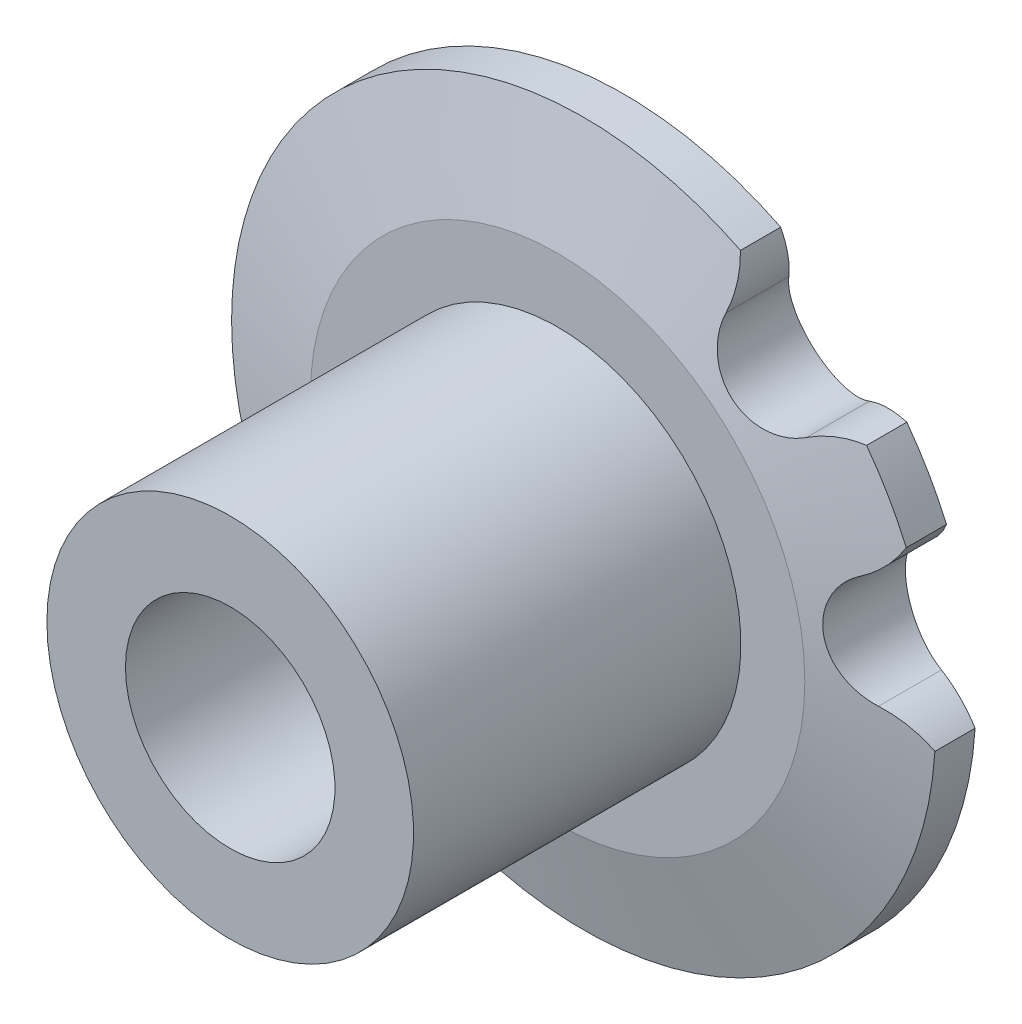
ISO-10303-21;
HEADER;
FILE_DESCRIPTION(('STEP AP214'),'2;1');
FILE_NAME('part.step','',(''),(''),'','','');
FILE_SCHEMA(('AUTOMOTIVE_DESIGN { 1 0 10303 214 1 1 1 1 }'));
ENDSEC;
DATA;
#1=APPLICATION_CONTEXT('core data for automotive mechanical design processes');
#2=APPLICATION_PROTOCOL_DEFINITION('international standard','automotive_design',2000,#1);
#3=PRODUCT_CONTEXT('',#1,'mechanical');
#4=PRODUCT('Part','Part','',(#3));
#5=PRODUCT_RELATED_PRODUCT_CATEGORY('part','',(#4));
#6=PRODUCT_DEFINITION_FORMATION('','',#4);
#7=PRODUCT_DEFINITION_CONTEXT('part definition',#1,'design');
#8=PRODUCT_DEFINITION('design','',#6,#7);
#9=PRODUCT_DEFINITION_SHAPE('','',#8);
#10=(LENGTH_UNIT() NAMED_UNIT(*) SI_UNIT(.MILLI.,.METRE.));
#11=(NAMED_UNIT(*) PLANE_ANGLE_UNIT() SI_UNIT($,.RADIAN.));
#12=(NAMED_UNIT(*) SI_UNIT($,.STERADIAN.) SOLID_ANGLE_UNIT());
#13=UNCERTAINTY_MEASURE_WITH_UNIT(LENGTH_MEASURE(1.E-05),#10,'distance_accuracy_value','');
#14=(GEOMETRIC_REPRESENTATION_CONTEXT(3) GLOBAL_UNCERTAINTY_ASSIGNED_CONTEXT((#13)) GLOBAL_UNIT_ASSIGNED_CONTEXT((#10,
#11,#12)) REPRESENTATION_CONTEXT('',''));
#15=CARTESIAN_POINT('',(0.,0.,0.));
#16=DIRECTION('',(0.,0.,1.));
#17=DIRECTION('',(1.,0.,0.));
#18=AXIS2_PLACEMENT_3D('',#15,#16,#17);
#19=CARTESIAN_POINT('',(7.30623277069294,5.5695696807266,-0.964341276799968));
#20=DIRECTION('',(0.,0.,1.));
#21=DIRECTION('',(1.,0.,0.));
#22=AXIS2_PLACEMENT_3D('',#19,#20,#21);
#23=CYLINDRICAL_SURFACE('',#22,2.80114785357706);
#24=CARTESIAN_POINT('',(9.78137473206816,4.25804325375725,0.609599999999894));
#25=CARTESIAN_POINT('',(9.74311831520241,4.18582574449715,0.625447552588147));
#26=CARTESIAN_POINT('',(9.70172896563199,4.11537180227463,0.641742653743285));
#27=CARTESIAN_POINT('',(9.61305896144405,3.97846275214148,0.675146689472055));
#28=CARTESIAN_POINT('',(9.56577747325192,3.91200821201219,0.692255738984705));
#29=CARTESIAN_POINT('',(9.46681297773902,3.78500737793997,0.726816270248554));
#30=CARTESIAN_POINT('',(9.41525013106971,3.72436306303879,0.74425186281707));
#31=CARTESIAN_POINT('',(9.30727577530858,3.60779311139582,0.779727547399209));
#32=CARTESIAN_POINT('',(9.25086588836088,3.55186590831362,0.797767435951237));
#33=CARTESIAN_POINT('',(9.12171250259878,3.43425967043977,0.838077538336455));
#34=CARTESIAN_POINT('',(9.04797434210589,3.37370857148026,0.860464769184654));
#35=CARTESIAN_POINT('',(8.89380117900932,3.25972167282012,0.906129145547605));
#36=CARTESIAN_POINT('',(8.81328888276197,3.20639357044997,0.929414244469626));
#37=CARTESIAN_POINT('',(8.73028305554489,3.15741087919374,0.952906400000197));
#38=B_SPLINE_CURVE_WITH_KNOTS('',3,(#24,#25,#26,#27,#28,#29,#30,#31,#32,#33,#34,#35,#36,#37),
.UNSPECIFIED.,.F.,.F.,(4,2,2,2,2,2,4),(0.,0.249656303963315,0.49934796756845,0.743529358490469,
0.987629345909163,1.28114971188036,1.57865289933327),.UNSPECIFIED.);
#39=CARTESIAN_POINT('',(9.78137473206809,4.25804325375711,0.609599999999938));
#40=VERTEX_POINT('',#39);
#41=CARTESIAN_POINT('',(8.73028305554495,3.15741087919364,0.952906400000192));
#42=VERTEX_POINT('',#41);
#43=EDGE_CURVE('E123',#40,#42,#38,.T.);
#44=ORIENTED_EDGE('',*,*,#43,.T.);
#45=DIRECTION('',(0.,0.,1.));
#46=VECTOR('',#45,1.);
#47=CARTESIAN_POINT('',(8.73028305554464,3.15741087919332,0.));
#48=LINE('',#47,#46);
#49=CARTESIAN_POINT('',(8.73028305554499,3.15741087919366,-0.95290640000018));
#50=VERTEX_POINT('',#49);
#51=EDGE_CURVE('E91',#50,#42,#48,.T.);
#52=ORIENTED_EDGE('',*,*,#51,.F.);
#53=CARTESIAN_POINT('',(9.78137473206791,4.25804325375678,-0.609599999999998));
#54=CARTESIAN_POINT('',(9.74311831520214,4.18582574449669,-0.625447552588252));
#55=CARTESIAN_POINT('',(9.70172896563171,4.11537180227417,-0.641742653743392));
#56=CARTESIAN_POINT('',(9.61305896144375,3.97846275214104,-0.675146689472165));
#57=CARTESIAN_POINT('',(9.56577747325161,3.91200821201176,-0.692255738984817));
#58=CARTESIAN_POINT('',(9.46681297773869,3.78500737793956,-0.726816270248669));
#59=CARTESIAN_POINT('',(9.41525013106936,3.72436306303839,-0.744251862817187));
#60=CARTESIAN_POINT('',(9.30727577530821,3.60779311139544,-0.779727547399329));
#61=CARTESIAN_POINT('',(9.25086588836049,3.55186590831325,-0.797767435951358));
#62=CARTESIAN_POINT('',(9.1217125025985,3.43425967043954,-0.838077538336538));
#63=CARTESIAN_POINT('',(9.04797434210574,3.37370857148015,-0.860464769184698));
#64=CARTESIAN_POINT('',(8.89380117900945,3.25972167282022,-0.906129145547566));
#65=CARTESIAN_POINT('',(8.81328888276226,3.20639357045016,-0.929414244469543));
#66=CARTESIAN_POINT('',(8.73028305554535,3.15741087919401,-0.952906400000068));
#67=B_SPLINE_CURVE_WITH_KNOTS('',3,(#53,#54,#55,#56,#57,#58,#59,#60,#61,#62,#63,#64,#65,#66),
.UNSPECIFIED.,.F.,.F.,(4,2,2,2,2,2,4),(0.,0.249656303963313,0.499347967568445,0.743529358490468,
0.987629345909162,1.28114971187982,1.57865289933218),.UNSPECIFIED.);
#68=CARTESIAN_POINT('',(9.78137473206796,4.25804325375687,-0.609599999999977));
#69=VERTEX_POINT('',#68);
#70=EDGE_CURVE('E21',#69,#50,#67,.T.);
#71=ORIENTED_EDGE('',*,*,#70,.F.);
#72=DIRECTION('',(0.,0.,-1.));
#73=VECTOR('',#72,1.);
#74=CARTESIAN_POINT('',(9.78137473206802,4.25804325375698,0.));
#75=LINE('',#74,#73);
#76=EDGE_CURVE('E63',#40,#69,#75,.T.);
#77=ORIENTED_EDGE('',*,*,#76,.F.);
#78=EDGE_LOOP('',(#44,#52,#71,#77));
#79=FACE_BOUND('',#78,.T.);
#80=ADVANCED_FACE('F17',(#79),#23,.T.);
#81=CARTESIAN_POINT('',(8.77051804082876,-2.73480475052688,-0.964341276799968));
#82=DIRECTION('',(0.,0.,1.));
#83=DIRECTION('',(1.,0.,0.));
#84=AXIS2_PLACEMENT_3D('',#81,#82,#83);
#85=CYLINDRICAL_SURFACE('',#84,2.80114785357706);
#86=CARTESIAN_POINT('',(9.28368068610777,0.0189369579653367,0.952906400000168));
#87=CARTESIAN_POINT('',(9.36319544452914,0.00412739989400414,0.933193019183733));
#88=CARTESIAN_POINT('',(9.44210191578075,-0.0141482527100653,0.913625769291378));
#89=CARTESIAN_POINT('',(9.59815467167981,-0.0574935698200914,0.874885171540078));
#90=CARTESIAN_POINT('',(9.67530036773296,-0.082565471140632,0.855711955606583));
#91=CARTESIAN_POINT('',(9.82554765363284,-0.138724537723859,0.818294368970953));
#92=CARTESIAN_POINT('',(9.89870100768582,-0.169665743879065,0.800038826539732));
#93=CARTESIAN_POINT('',(10.0422010430679,-0.237695193515974,0.764113677188546));
#94=CARTESIAN_POINT('',(10.1125488029666,-0.274781045957689,0.746443845550497));
#95=CARTESIAN_POINT('',(10.2638496830696,-0.362986979713577,0.708263039791928));
#96=CARTESIAN_POINT('',(10.3440738553339,-0.415428683576038,0.687899338208294));
#97=CARTESIAN_POINT('',(10.4999693460649,-0.529154444580699,0.648000805542795));
#98=CARTESIAN_POINT('',(10.575563700514,-0.590549285844654,0.628481056061455));
#99=CARTESIAN_POINT('',(10.6478222208032,-0.655824636757204,0.609599999999899));
#100=B_SPLINE_CURVE_WITH_KNOTS('',3,(#86,#87,#88,#89,#90,#91,#92,#93,#94,#95,#96,#97,#98,#99),
.UNSPECIFIED.,.F.,.F.,(4,2,2,2,2,2,4),(0.,0.24967775903051,0.499437793209428,0.74365091891204,
0.987769237229413,1.28120987822385,1.57865032510782),.UNSPECIFIED.);
#101=CARTESIAN_POINT('',(9.28368068610758,0.0189369579647223,0.952906400000217));
#102=VERTEX_POINT('',#101);
#103=CARTESIAN_POINT('',(10.6478222208032,-0.655824636757138,0.609599999999941));
#104=VERTEX_POINT('',#103);
#105=EDGE_CURVE('E111',#102,#104,#100,.T.);
#106=ORIENTED_EDGE('',*,*,#105,.T.);
#107=DIRECTION('',(0.,0.,1.));
#108=VECTOR('',#107,1.);
#109=CARTESIAN_POINT('',(10.6478222208031,-0.655824636757072,0.));
#110=LINE('',#109,#108);
#111=CARTESIAN_POINT('',(10.6478222208031,-0.655824636757045,-0.609599999999976));
#112=VERTEX_POINT('',#111);
#113=EDGE_CURVE('E100',#112,#104,#110,.T.);
#114=ORIENTED_EDGE('',*,*,#113,.F.);
#115=CARTESIAN_POINT('',(9.28368068610792,0.0189369579653103,-0.952906400000132));
#116=CARTESIAN_POINT('',(9.36319544452928,0.004127399893974,-0.933193019183697));
#117=CARTESIAN_POINT('',(9.44210191578089,-0.0141482527100999,-0.913625769291342));
#118=CARTESIAN_POINT('',(9.59815467167996,-0.0574935698201352,-0.874885171540042));
#119=CARTESIAN_POINT('',(9.6753003677331,-0.0825654711406803,-0.855711955606548));
#120=CARTESIAN_POINT('',(9.82554765363297,-0.138724537723915,-0.818294368970918));
#121=CARTESIAN_POINT('',(9.89870100768596,-0.169665743879125,-0.800038826539698));
#122=CARTESIAN_POINT('',(10.0422010430681,-0.237695193516042,-0.764113677188512));
#123=CARTESIAN_POINT('',(10.1125488029668,-0.274781045957761,-0.746443845550464));
#124=CARTESIAN_POINT('',(10.2638496830697,-0.362986979713622,-0.708263039791911));
#125=CARTESIAN_POINT('',(10.3440738553339,-0.415428683576046,-0.687899338208292));
#126=CARTESIAN_POINT('',(10.4999693460647,-0.52915444458062,-0.648000805542822));
#127=CARTESIAN_POINT('',(10.5755637005138,-0.590549285844523,-0.628481056061496));
#128=CARTESIAN_POINT('',(10.647822220803,-0.655824636757018,-0.609599999999952));
#129=B_SPLINE_CURVE_WITH_KNOTS('',3,(#115,#116,#117,#118,#119,#120,#121,#122,#123,#124,#125,
#126,#127,#128),.UNSPECIFIED.,.F.,.F.,(4,2,2,2,2,2,4),(0.,0.249677759030511,0.499437793209429,
0.743650918912043,0.987769237229417,1.28120987822363,1.57865032510738),.UNSPECIFIED.);
#130=CARTESIAN_POINT('',(9.28368068610765,0.0189369579647088,-0.952906400000199));
#131=VERTEX_POINT('',#130);
#132=EDGE_CURVE('E76',#131,#112,#129,.T.);
#133=ORIENTED_EDGE('',*,*,#132,.F.);
#134=DIRECTION('',(0.,0.,-1.));
#135=VECTOR('',#134,1.);
#136=CARTESIAN_POINT('',(9.28368068610738,0.0189369579641076,0.));
#137=LINE('',#136,#135);
#138=EDGE_CURVE('E132',#102,#131,#137,.T.);
#139=ORIENTED_EDGE('',*,*,#138,.F.);
#140=EDGE_LOOP('',(#106,#114,#133,#139));
#141=FACE_BOUND('',#140,.T.);
#142=ADVANCED_FACE('F239',(#141),#85,.T.);
#143=CARTESIAN_POINT('',(2.01684863206683,8.96289380297004,-0.964341276799968));
#144=DIRECTION('',(0.,0.,1.));
#145=DIRECTION('',(1.,0.,0.));
#146=AXIS2_PLACEMENT_3D('',#143,#144,#145);
#147=CYLINDRICAL_SURFACE('',#146,2.80114785357691);
#148=CARTESIAN_POINT('',(4.75595031454055,9.54919685657643,0.60959999999968));
#149=CARTESIAN_POINT('',(4.77306471914179,9.46928428415955,0.625447552587919));
#150=CARTESIAN_POINT('',(4.78664555901335,9.38870887214733,0.641742653743044));
#151=CARTESIAN_POINT('',(4.80672383611354,9.2268344750373,0.67514668947179));
#152=CARTESIAN_POINT('',(4.81322026982417,9.14553538907381,0.692255738984428));
#153=CARTESIAN_POINT('',(4.81904363053209,8.98463395434676,0.726816270248255));
#154=CARTESIAN_POINT('',(4.81852561258615,8.90503375495076,0.74425186281676));
#155=CARTESIAN_POINT('',(4.810742177934,8.74633141321288,0.779727547398878));
#156=CARTESIAN_POINT('',(4.80347901068649,8.66722911367877,0.797767435950897));
#157=CARTESIAN_POINT('',(4.78013760974076,8.49411931256238,0.838077538336107));
#158=CARTESIAN_POINT('',(4.76257239781352,8.40033650375372,0.860464769184311));
#159=CARTESIAN_POINT('',(4.71773826907081,8.21391687446196,0.906129145547272));
#160=CARTESIAN_POINT('',(4.69034091537948,8.12131287152395,0.929414244469299));
#161=CARTESIAN_POINT('',(4.65824022972202,8.03043483581111,0.952906399999877));
#162=B_SPLINE_CURVE_WITH_KNOTS('',3,(#148,#149,#150,#151,#152,#153,#154,#155,#156,#157,#158,
#159,#160,#161),.UNSPECIFIED.,.F.,.F.,(4,2,2,2,2,2,4),(0.,0.249656303963291,0.499347967568398,
0.74352935849039,0.987629345909055,1.28114971188039,1.57865289933345),.UNSPECIFIED.);
#163=CARTESIAN_POINT('',(4.75595031454079,9.54919685657532,0.6095999999999));
#164=VERTEX_POINT('',#163);
#165=CARTESIAN_POINT('',(4.65824022972125,8.03043483581139,0.952906399999912));
#166=VERTEX_POINT('',#165);
#167=EDGE_CURVE('E115',#164,#166,#162,.T.);
#168=ORIENTED_EDGE('',*,*,#167,.T.);
#169=DIRECTION('',(0.,0.,1.));
#170=VECTOR('',#169,1.);
#171=CARTESIAN_POINT('',(4.65824022972053,8.03043483581179,0.));
#172=LINE('',#171,#170);
#173=CARTESIAN_POINT('',(4.65824022972122,8.0304348358113,-0.952906399999935));
#174=VERTEX_POINT('',#173);
#175=EDGE_CURVE('E141',#174,#166,#172,.T.);
#176=ORIENTED_EDGE('',*,*,#175,.F.);
#177=CARTESIAN_POINT('',(4.75595031454083,9.54919685657512,-0.60959999999994));
#178=CARTESIAN_POINT('',(4.77306471914203,9.46928428415823,-0.625447552588185));
#179=CARTESIAN_POINT('',(4.78664555901355,9.388708872146,-0.641742653743315));
#180=CARTESIAN_POINT('',(4.80672383611367,9.22683447503597,-0.675146689472069));
#181=CARTESIAN_POINT('',(4.81322026982426,9.14553538907247,-0.692255738984712));
#182=CARTESIAN_POINT('',(4.8190436305321,8.98463395434542,-0.726816270248547));
#183=CARTESIAN_POINT('',(4.81852561258612,8.90503375494941,-0.744251862817056));
#184=CARTESIAN_POINT('',(4.8107421779339,8.74633141321154,-0.779727547399183));
#185=CARTESIAN_POINT('',(4.80347901068635,8.66722911367743,-0.797767435951204));
#186=CARTESIAN_POINT('',(4.78013760974056,8.49411931256121,-0.838077538336383));
#187=CARTESIAN_POINT('',(4.76257239781332,8.40033650375273,-0.86046476918455));
#188=CARTESIAN_POINT('',(4.71773826907063,8.21391687446132,-0.906129145547433));
#189=CARTESIAN_POINT('',(4.69034091537932,8.12131287152348,-0.92941424446942));
#190=CARTESIAN_POINT('',(4.65824022972191,8.03043483581081,-0.952906399999955));
#191=B_SPLINE_CURVE_WITH_KNOTS('',3,(#177,#178,#179,#180,#181,#182,#183,#184,#185,#186,#187,
#188,#189,#190),.UNSPECIFIED.,.F.,.F.,(4,2,2,2,2,2,4),(0.,0.24965630396329,0.499347967568401,
0.7435293584904,0.987629345909071,1.28114971187989,1.57865289933241),.UNSPECIFIED.);
#192=CARTESIAN_POINT('',(4.75595031454096,9.54919685657451,-0.60960000000006));
#193=VERTEX_POINT('',#192);
#194=EDGE_CURVE('E42',#193,#174,#191,.T.);
#195=ORIENTED_EDGE('',*,*,#194,.F.);
#196=DIRECTION('',(0.,0.,-1.));
#197=VECTOR('',#196,1.);
#198=CARTESIAN_POINT('',(4.75595031454102,9.54919685657421,0.));
#199=LINE('',#198,#197);
#200=EDGE_CURVE('E105',#164,#193,#199,.T.);
#201=ORIENTED_EDGE('',*,*,#200,.F.);
#202=EDGE_LOOP('',(#168,#176,#195,#201));
#203=FACE_BOUND('',#202,.T.);
#204=ADVANCED_FACE('F323',(#203),#147,.T.);
#205=CARTESIAN_POINT('',(8.47650521700138,3.54259834502028,-0.964341276799968));
#206=DIRECTION('',(0.,0.,1.));
#207=DIRECTION('',(1.,0.,0.));
#208=AXIS2_PLACEMENT_3D('',#205,#206,#207);
#209=CYLINDRICAL_SURFACE('',#208,2.8011478535787);
#210=CARTESIAN_POINT('',(7.09953955933862,5.98194146873738,0.952906399999816));
#211=CARTESIAN_POINT('',(7.1699707986065,6.02170779057223,0.933193019183374));
#212=CARTESIAN_POINT('',(7.24216402548782,6.0584279304951,0.913625769291011));
#213=CARTESIAN_POINT('',(7.38956920475409,6.12553226913703,0.874885171539698));
#214=CARTESIAN_POINT('',(7.46478214404634,6.15591437601558,0.855711955606198));
#215=CARTESIAN_POINT('',(7.61597659467503,6.20947112889415,0.818294368970556));
#216=CARTESIAN_POINT('',(7.69190393898822,6.23279085944779,0.800038826539331));
#217=CARTESIAN_POINT('',(7.84555983100059,6.27291732231812,0.764113677188136));
#218=CARTESIAN_POINT('',(7.9232876680011,6.28972657956885,0.746443845550083));
#219=CARTESIAN_POINT('',(8.09588854776187,6.31941124522972,0.708263039791586));
#220=CARTESIAN_POINT('',(8.1910527066021,6.33080567332696,0.687899338208023));
#221=CARTESIAN_POINT('',(8.38357709105921,6.34389437591763,0.648000805542663));
#222=CARTESIAN_POINT('',(8.48094956947896,6.34545431333335,0.628481056061391));
#223=CARTESIAN_POINT('',(8.57826099419875,6.34189737503038,0.609599999999897));
#224=B_SPLINE_CURVE_WITH_KNOTS('',3,(#210,#211,#212,#213,#214,#215,#216,#217,#218,#219,#220,
#221,#222,#223),.UNSPECIFIED.,.F.,.F.,(4,2,2,2,2,2,4),(0.,0.249677759030646,0.499437793209701,
0.743650918912456,0.987769237229968,1.28120987822347,1.57865032510647),.UNSPECIFIED.);
#225=CARTESIAN_POINT('',(7.09953955933912,5.98194146873635,0.952906399999884));
#226=VERTEX_POINT('',#225);
#227=CARTESIAN_POINT('',(8.57826099420003,6.3418973750283,0.60959999999994));
#228=VERTEX_POINT('',#227);
#229=EDGE_CURVE('E119',#226,#228,#224,.T.);
#230=ORIENTED_EDGE('',*,*,#229,.T.);
#231=DIRECTION('',(0.,0.,-1.));
#232=VECTOR('',#231,1.);
#233=CARTESIAN_POINT('',(8.5782609942013,6.34189737502623,0.));
#234=LINE('',#233,#232);
#235=CARTESIAN_POINT('',(8.57826099420021,6.3418973750283,-0.609599999999912));
#236=VERTEX_POINT('',#235);
#237=EDGE_CURVE('E138',#228,#236,#234,.T.);
#238=ORIENTED_EDGE('',*,*,#237,.T.);
#239=CARTESIAN_POINT('',(7.09953955941715,5.98194146878171,-0.952906399977837));
#240=CARTESIAN_POINT('',(7.16997079868624,6.02170779061425,-0.93319301916153));
#241=CARTESIAN_POINT('',(7.24216402556866,6.05842793053476,-0.913625769269324));
#242=CARTESIAN_POINT('',(7.38956920483694,6.1255322691719,-0.874885171518362));
#243=CARTESIAN_POINT('',(7.4647821441301,6.155914376048,-0.855711955585056));
#244=CARTESIAN_POINT('',(7.61597659476048,6.20947112892172,-0.818294368949812));
#245=CARTESIAN_POINT('',(7.69190393907446,6.23279085947294,-0.80003882651879));
#246=CARTESIAN_POINT('',(7.84555983108819,6.27291732233836,-0.764113677168034));
#247=CARTESIAN_POINT('',(7.92328766808927,6.2897265795866,-0.746443845530219));
#248=CARTESIAN_POINT('',(8.09588854783663,6.31941124523947,-0.708263039775478));
#249=CARTESIAN_POINT('',(8.19105270666252,6.33080567333264,-0.687899338195295));
#250=CARTESIAN_POINT('',(8.38357709109006,6.34389437591813,-0.648000805536479));
#251=CARTESIAN_POINT('',(8.48094956949456,6.34545431333278,-0.628481056058363));
#252=CARTESIAN_POINT('',(8.57826099419913,6.34189737503037,-0.609599999999823));
#253=B_SPLINE_CURVE_WITH_KNOTS('',3,(#239,#240,#241,#242,#243,#244,#245,#246,#247,#248,#249,
#250,#251,#252),.UNSPECIFIED.,.F.,.F.,(4,2,2,2,2,2,4),(0.,0.249677759030287,0.499437793209003,
0.743650918911737,0.987769237229208,1.28120987817765,1.57865032501415),.UNSPECIFIED.);
#254=CARTESIAN_POINT('',(7.09953955937839,5.98194146875852,-0.952906399988894));
#255=VERTEX_POINT('',#254);
#256=EDGE_CURVE('E84',#255,#236,#253,.T.);
#257=ORIENTED_EDGE('',*,*,#256,.F.);
#258=DIRECTION('',(0.,0.,-1.));
#259=VECTOR('',#258,1.);
#260=CARTESIAN_POINT('',(7.09953955933963,5.98194146873533,0.));
#261=LINE('',#260,#259);
#262=EDGE_CURVE('E149',#226,#255,#261,.T.);
#263=ORIENTED_EDGE('',*,*,#262,.F.);
#264=EDGE_LOOP('',(#230,#238,#257,#263));
#265=FACE_BOUND('',#264,.T.);
#266=ADVANCED_FACE('F216',(#265),#209,.T.);
#267=CARTESIAN_POINT('',(0.,0.,1.397));
#268=DIRECTION('',(0.,0.,-1.));
#269=DIRECTION('',(-1.,0.,0.));
#270=AXIS2_PLACEMENT_3D('',#267,#268,#269);
#271=CONICAL_SURFACE('',#270,7.493,1.32770090061305);
#272=CARTESIAN_POINT('',(0.,0.,1.397));
#273=DIRECTION('',(0.,0.,-1.));
#274=DIRECTION('',(-1.,0.,0.));
#275=AXIS2_PLACEMENT_3D('',#272,#273,#274);
#276=CIRCLE('',#275,7.493);
#277=CARTESIAN_POINT('',(-7.493,0.,1.397));
#278=VERTEX_POINT('',#277);
#279=EDGE_CURVE('E157',#278,#278,#276,.T.);
#280=ORIENTED_EDGE('',*,*,#279,.T.);
#281=EDGE_LOOP('',(#280));
#282=FACE_BOUND('',#281,.T.);
#283=CARTESIAN_POINT('',(0.,0.,0.609599999999983));
#284=DIRECTION('',(0.,0.,-1.));
#285=DIRECTION('',(0.,-1.,0.));
#286=AXIS2_PLACEMENT_3D('',#283,#284,#285);
#287=CIRCLE('',#286,10.668);
#288=EDGE_CURVE('E70',#40,#228,#287,.F.);
#289=ORIENTED_EDGE('',*,*,#288,.T.);
#290=ORIENTED_EDGE('',*,*,#229,.F.);
#291=CARTESIAN_POINT('',(4.65824022972049,8.03043483581167,0.952906399999948));
#292=CARTESIAN_POINT('',(4.64213824953229,7.98481882270761,0.964695072518763));
#293=CARTESIAN_POINT('',(4.62798001387568,7.93851631096545,0.976387205895126));
#294=CARTESIAN_POINT('',(4.60364372564877,7.84480588847695,0.999495301873529));
#295=CARTESIAN_POINT('',(4.59346597449813,7.79739789430656,1.01091124349974));
#296=CARTESIAN_POINT('',(4.56904794080134,7.65394064497028,1.04461441528304));
#297=CARTESIAN_POINT('',(4.56091846668723,7.55664562252976,1.06636023038743));
#298=CARTESIAN_POINT('',(4.56146016814984,7.36154564140247,1.10756866789206));
#299=CARTESIAN_POINT('',(4.57014934897037,7.2637402481319,1.1270288197139));
#300=CARTESIAN_POINT('',(4.60437154006129,7.0705612553931,1.16280414187421));
#301=CARTESIAN_POINT('',(4.62989351654583,6.97518610542311,1.17912136333616));
#302=CARTESIAN_POINT('',(4.69649248982918,6.79199096599581,1.20746687340126));
#303=CARTESIAN_POINT('',(4.73718171936884,6.70404463384054,1.21958864462626));
#304=CARTESIAN_POINT('',(4.83317712012351,6.53595476140701,1.23942572171289));
#305=CARTESIAN_POINT('',(4.88848274042501,6.45581092719675,1.24714119361986));
#306=CARTESIAN_POINT('',(5.00977991876571,6.30879424422792,1.25750938922882));
#307=CARTESIAN_POINT('',(5.0752853919106,6.24153274956466,1.26034340370387));
#308=CARTESIAN_POINT('',(5.21647158734003,6.11868453424902,1.26135123155235));
#309=CARTESIAN_POINT('',(5.29215022237393,6.06309542472526,1.25952599949564));
#310=CARTESIAN_POINT('',(5.44987005241239,5.96614137335263,1.251402924233));
#311=CARTESIAN_POINT('',(5.53175934591004,5.9245214230731,1.24519252950989));
#312=CARTESIAN_POINT('',(5.70079823640559,5.85507438908251,1.22872709241329));
#313=CARTESIAN_POINT('',(5.78794784709347,5.82724734126925,1.21847203951317));
#314=CARTESIAN_POINT('',(5.96626764553297,5.78566575245785,1.19426339175689));
#315=CARTESIAN_POINT('',(6.05747570149301,5.77210165828406,1.18026279976265));
#316=CARTESIAN_POINT('',(6.24041020380391,5.75981251805593,1.14925407931387));
#317=CARTESIAN_POINT('',(6.33213688886152,5.76109497545041,1.13224443436021));
#318=CARTESIAN_POINT('',(6.51699248425122,5.77854367160658,1.09524831053092));
#319=CARTESIAN_POINT('',(6.61005340721718,5.79524289614379,1.07517684863028));
#320=CARTESIAN_POINT('',(6.79169263597594,5.84362390235863,1.03329863624402));
#321=CARTESIAN_POINT('',(6.88027716019886,5.87528422986514,1.01149440766481));
#322=CARTESIAN_POINT('',(6.98831944146115,5.92424243112041,0.983210202205793));
#323=CARTESIAN_POINT('',(7.01094708041188,5.93510764532378,0.977186563397641));
#324=CARTESIAN_POINT('',(7.0556519349395,5.9578030591433,0.965086297644796));
#325=CARTESIAN_POINT('',(7.07772995065394,5.96963173413281,0.959009767504149));
#326=CARTESIAN_POINT('',(7.09953955933976,5.9819414687354,0.952906399999915));
#327=B_SPLINE_CURVE_WITH_KNOTS('',3,(#291,#292,#293,#294,#295,#296,#297,#298,#299,#300,#301,
#302,#303,#304,#305,#306,#307,#308,#309,#310,#311,#312,#313,#314,#315,#316,#317,#318,#319,#320,
#321,#322,#323,#324,#325,#326),.UNSPECIFIED.,.F.,.F.,(4,2,2,2,2,2,2,2,2,2,2,2,2,2,2,2,2,4),(0.,
0.149282264685795,0.298575831489097,0.597122537012875,0.895989029073246,1.19465981057532,
1.4861670123909,1.77766322843282,2.05807949618944,2.33843831786991,2.61335861762447,
2.8882796328908,3.16682665615758,3.44551446326444,3.73421301967238,4.02249883383324,
4.09992524008285,4.1772314186706),.UNSPECIFIED.);
#328=EDGE_CURVE('E145',#166,#226,#327,.T.);
#329=ORIENTED_EDGE('',*,*,#328,.F.);
#330=ORIENTED_EDGE('',*,*,#167,.F.);
#331=CARTESIAN_POINT('',(0.,0.,0.609599999999983));
#332=DIRECTION('',(0.,0.,-1.));
#333=DIRECTION('',(0.,-1.,0.));
#334=AXIS2_PLACEMENT_3D('',#331,#332,#333);
#335=CIRCLE('',#334,10.668);
#336=EDGE_CURVE('E153',#164,#104,#335,.F.);
#337=ORIENTED_EDGE('',*,*,#336,.T.);
#338=ORIENTED_EDGE('',*,*,#105,.F.);
#339=CARTESIAN_POINT('',(8.73028305554501,3.15741087919354,0.952906400000187));
#340=CARTESIAN_POINT('',(8.68862681507204,3.13281713919435,0.964695072519));
#341=CARTESIAN_POINT('',(8.64801829647771,3.10644809582693,0.976387205895359));
#342=CARTESIAN_POINT('',(8.56913971964124,3.05030481195534,0.999495301873758));
#343=CARTESIAN_POINT('',(8.53086983867603,3.02053031379583,1.01091124349997));
#344=CARTESIAN_POINT('',(8.41995199725764,2.92633129462991,1.04461441528326));
#345=CARTESIAN_POINT('',(8.35118442387811,2.85702450858007,1.06636023038764));
#346=CARTESIAN_POINT('',(8.22619154075465,2.70722105319667,1.10756866789226));
#347=CARTESIAN_POINT('',(8.16997974448264,2.62671247740497,1.1270288197141));
#348=CARTESIAN_POINT('',(8.07202240081493,2.45673118308061,1.16280414187442));
#349=CARTESIAN_POINT('',(8.0302674044056,2.36726436917553,1.17912136333636));
#350=CARTESIAN_POINT('',(7.96352961202803,2.18411975576654,1.20746687340146));
#351=CARTESIAN_POINT('',(7.93816855758488,2.09059442413055,1.21958864462647));
#352=CARTESIAN_POINT('',(7.90365921358386,1.90012545721634,1.23942572171311));
#353=CARTESIAN_POINT('',(7.89451031306591,1.80318195089352,1.24714119362008));
#354=CARTESIAN_POINT('',(7.89292884027017,1.61259231453218,1.25750938922904));
#355=CARTESIAN_POINT('',(7.89987408858812,1.51896091380534,1.2603434037041));
#356=CARTESIAN_POINT('',(7.92906367836488,1.33410098403494,1.26135123155259));
#357=CARTESIAN_POINT('',(7.95130488536001,1.24287196666857,1.25952599949589));
#358=CARTESIAN_POINT('',(8.00980442179933,1.06722050182615,1.25140292423326));
#359=CARTESIAN_POINT('',(8.04578247167865,0.982700346965366,1.24519252951016));
#360=CARTESIAN_POINT('',(8.13063408143505,0.820844728120103,1.22872709241358));
#361=CARTESIAN_POINT('',(8.17950767487392,0.743509282835179,1.21847203951347));
#362=CARTESIAN_POINT('',(8.28938043548746,0.597034180791448,1.19426339175721));
#363=CARTESIAN_POINT('',(8.35053102825177,0.528016073548969,1.18026279976298));
#364=CARTESIAN_POINT('',(8.48276768012935,0.40101401449688,1.14925407931421));
#365=CARTESIAN_POINT('',(8.55385874522653,0.343035657224804,1.13224443436057));
#366=CARTESIAN_POINT('',(8.70668215254854,0.237579247657171,1.0952483105313));
#367=CARTESIAN_POINT('',(8.78870501008199,0.190553187589767,1.07517684863067));
#368=CARTESIAN_POINT('',(8.95894744326404,0.110859742873974,1.03329863624443));
#369=CARTESIAN_POINT('',(9.0471579920311,0.0781719262471788,1.01149440766523));
#370=CARTESIAN_POINT('',(9.16139290637345,0.0462278445461535,0.983210202206203));
#371=CARTESIAN_POINT('',(9.18571070851915,0.0400063155559325,0.977186563398031));
#372=CARTESIAN_POINT('',(9.23454494471054,0.028656284613414,0.965086297645146));
#373=CARTESIAN_POINT('',(9.25906101168603,0.0235261004108634,0.959009767504478));
#374=CARTESIAN_POINT('',(9.28368068610755,0.0189369579640711,0.952906400000223));
#375=B_SPLINE_CURVE_WITH_KNOTS('',3,(#339,#340,#341,#342,#343,#344,#345,#346,#347,#348,#349,
#350,#351,#352,#353,#354,#355,#356,#357,#358,#359,#360,#361,#362,#363,#364,#365,#366,#367,#368,
#369,#370,#371,#372,#373,#374),.UNSPECIFIED.,.F.,.F.,(4,2,2,2,2,2,2,2,2,2,2,2,2,2,2,2,2,4),(0.,
0.14928226468575,0.298575831489007,0.597122537012693,0.895989029072974,1.19465981057495,
1.48616701239045,1.77766322843228,2.05807949618882,2.33843831786921,2.61335861762368,
2.88827963288992,3.1668266561566,3.44551446326337,3.7342130196712,4.02249883383197,
4.09992524008184,4.17723141866985),.UNSPECIFIED.);
#376=EDGE_CURVE('E128',#42,#102,#375,.T.);
#377=ORIENTED_EDGE('',*,*,#376,.F.);
#378=ORIENTED_EDGE('',*,*,#43,.F.);
#379=EDGE_LOOP('',(#289,#290,#329,#330,#337,#338,#377,#378));
#380=FACE_BOUND('',#379,.T.);
#381=ADVANCED_FACE('F211',(#282,#380),#271,.T.);
#382=CARTESIAN_POINT('',(9.59544580361916,1.69193598710399,-1.27731499715926));
#383=DIRECTION('',(0.,0.,1.));
#384=DIRECTION('',(1.,0.,0.));
#385=AXIS2_PLACEMENT_3D('',#382,#383,#384);
#386=CYLINDRICAL_SURFACE('',#385,1.70180000000003);
#387=ORIENTED_EDGE('',*,*,#376,.T.);
#388=ORIENTED_EDGE('',*,*,#138,.T.);
#389=CARTESIAN_POINT('',(9.2836806861077,0.0189369579640489,-0.952906400000187));
#390=CARTESIAN_POINT('',(9.23612506984612,0.0278002406218443,-0.964695072519));
#391=CARTESIAN_POINT('',(9.1889468005901,0.0386901047415143,-0.97638720589536));
#392=CARTESIAN_POINT('',(9.09562305000224,0.064469472147393,-0.999495301873758));
#393=CARTESIAN_POINT('',(9.04947764713292,0.0793592781827172,-1.01091124349997));
#394=CARTESIAN_POINT('',(8.91303100800228,0.129941265358907,-1.04461441528326));
#395=CARTESIAN_POINT('',(8.82470630984998,0.171548445476898,-1.06636023038764));
#396=CARTESIAN_POINT('',(8.65601562064719,0.269567563268336,-1.10756866789226));
#397=CARTESIAN_POINT('',(8.57565825585803,0.325995311232228,-1.1270288197141));
#398=CARTESIAN_POINT('',(8.4254714362142,0.452222094459431,-1.16280414187442));
#399=CARTESIAN_POINT('',(8.35563512169271,0.52201234943478,-1.17912136333636));
#400=CARTESIAN_POINT('',(8.23028296374049,0.671286321877685,-1.20746687340146));
#401=CARTESIAN_POINT('',(8.17446382069418,0.750497394397036,-1.21958864462647));
#402=CARTESIAN_POINT('',(8.07689142142517,0.917676786313733,-1.23942572171311));
#403=CARTESIAN_POINT('',(8.03513763519312,1.00564477557197,-1.24714119362008));
#404=CARTESIAN_POINT('',(7.9684660421323,1.18419955490672,-1.25750938922904));
#405=CARTESIAN_POINT('',(7.94296861562982,1.27455970606872,-1.2603434037041));
#406=CARTESIAN_POINT('',(7.90717203807156,1.45825464563204,-1.26135123155259));
#407=CARTESIAN_POINT('',(7.89686977456715,1.55158882085697,-1.25952599949589));
#408=CARTESIAN_POINT('',(7.8917650180978,1.73665522603709,-1.25140292423326));
#409=CARTESIAN_POINT('',(7.89666573060028,1.82838340964376,-1.24519252951016));
#410=CARTESIAN_POINT('',(7.92104228019464,2.00949890003568,-1.22872709241358));
#411=CARTESIAN_POINT('',(7.94051815521994,2.09888620072792,-1.21847203951347));
#412=CARTESIAN_POINT('',(7.99366734219921,2.27410647057991,-1.19426339175721));
#413=CARTESIAN_POINT('',(8.02752452004538,2.35987701115798,-1.18026279976298));
#414=CARTESIAN_POINT('',(8.10834906357252,2.52444750750192,-1.14925407931421));
#415=CARTESIAN_POINT('',(8.15532304678417,2.60324391826949,-1.13224443436057));
#416=CARTESIAN_POINT('',(8.26286185861309,2.75460921183057,-1.0952483105313));
#417=CARTESIAN_POINT('',(8.32385427276874,2.82685272295011,-1.07517684863067));
#418=CARTESIAN_POINT('',(8.45657306759074,2.95996640627159,-1.03329863624443));
#419=CARTESIAN_POINT('',(8.52828397761493,3.02085269087754,-1.01149440766523));
#420=CARTESIAN_POINT('',(8.62470416425683,3.08994095050601,-0.983210202206175));
#421=CARTESIAN_POINT('',(8.64542753525004,3.10410445356343,-0.977186563397976));
#422=CARTESIAN_POINT('',(8.68743476743128,3.13147228634729,-0.965086297645036));
#423=CARTESIAN_POINT('',(8.7087177083227,3.1446780713265,-0.959009767504342));
#424=CARTESIAN_POINT('',(8.73028305554546,3.15741087919381,-0.952906400000059));
#425=B_SPLINE_CURVE_WITH_KNOTS('',3,(#389,#390,#391,#392,#393,#394,#395,#396,#397,#398,#399,
#400,#401,#402,#403,#404,#405,#406,#407,#408,#409,#410,#411,#412,#413,#414,#415,#416,#417,#418,
#419,#420,#421,#422,#423,#424),.UNSPECIFIED.,.F.,.F.,(4,2,2,2,2,2,2,2,2,2,2,2,2,2,2,2,2,4),(0.,
0.14928226468575,0.298575831489006,0.597122537012693,0.895989029072973,1.19465981057495,
1.48616701239045,1.77766322843228,2.05807949618882,2.33843831786921,2.61335861762368,
2.88827963288992,3.1668266561566,3.44551446326337,3.7342130196712,4.02249883383197,
4.09992524008219,4.17723141867054),.UNSPECIFIED.);
#426=EDGE_CURVE('E88',#131,#50,#425,.T.);
#427=ORIENTED_EDGE('',*,*,#426,.T.);
#428=ORIENTED_EDGE('',*,*,#51,.T.);
#429=EDGE_LOOP('',(#387,#388,#427,#428));
#430=FACE_BOUND('',#429,.T.);
#431=ADVANCED_FACE('F215',(#430),#386,.F.);
#432=CARTESIAN_POINT('',(0.,0.,0.609599999999983));
#433=DIRECTION('',(0.,0.,-1.));
#434=DIRECTION('',(-1.,0.,0.));
#435=AXIS2_PLACEMENT_3D('',#432,#433,#434);
#436=CYLINDRICAL_SURFACE('',#435,10.668);
#437=ORIENTED_EDGE('',*,*,#237,.F.);
#438=ORIENTED_EDGE('',*,*,#288,.F.);
#439=ORIENTED_EDGE('',*,*,#76,.T.);
#440=CARTESIAN_POINT('',(0.,0.,-0.6096));
#441=DIRECTION('',(0.,0.,-1.));
#442=DIRECTION('',(0.,-1.,0.));
#443=AXIS2_PLACEMENT_3D('',#440,#441,#442);
#444=CIRCLE('',#443,10.668);
#445=EDGE_CURVE('E67',#69,#236,#444,.F.);
#446=ORIENTED_EDGE('',*,*,#445,.T.);
#447=EDGE_LOOP('',(#437,#438,#439,#446));
#448=FACE_BOUND('',#447,.T.);
#449=ADVANCED_FACE('F66',(#448),#436,.T.);
#450=CARTESIAN_POINT('',(6.26298244821884,7.46393183302088,-1.27731499715926));
#451=DIRECTION('',(0.,0.,1.));
#452=DIRECTION('',(1.,0.,0.));
#453=AXIS2_PLACEMENT_3D('',#450,#451,#452);
#454=CYLINDRICAL_SURFACE('',#453,1.70180000000058);
#455=ORIENTED_EDGE('',*,*,#328,.T.);
#456=ORIENTED_EDGE('',*,*,#262,.T.);
#457=CARTESIAN_POINT('',(7.09953955947478,5.98194146859127,-0.952906399799643));
#458=CARTESIAN_POINT('',(7.05741263559478,5.95816297623406,-0.964695072430003));
#459=CARTESIAN_POINT('',(7.01427211485591,5.93617948925401,-0.97638720585373));
#460=CARTESIAN_POINT('',(6.92621131634319,5.89594027986785,-0.999495301868688));
#461=CARTESIAN_POINT('',(6.88129090407163,5.87768483981593,-1.01091124348407));
#462=CARTESIAN_POINT('',(6.74425323974973,5.82872668096596,-1.04461441525224));
#463=CARTESIAN_POINT('',(6.64984801567518,5.80382560849075,-1.06636023036843));
#464=CARTESIAN_POINT('',(6.45761797616041,5.77048032410284,-1.10756866788409));
#465=CARTESIAN_POINT('',(6.35978960616106,5.76205376842855,-1.12702881970522));
#466=CARTESIAN_POINT('',(6.16360281526418,5.76221086748031,-1.16280414186661));
#467=CARTESIAN_POINT('',(6.06524478341732,5.7707833868064,-1.1791213633304));
#468=CARTESIAN_POINT('',(5.8732679994452,5.80455906991722,-1.20746687339739));
#469=CARTESIAN_POINT('',(5.77959215912926,5.82935841831875,-1.21958864462265));
#470=CARTESIAN_POINT('',(5.59738652314677,5.89470693319976,-1.23942572171017));
#471=CARTESIAN_POINT('',(5.50885653367889,5.93525550609472,-1.24714119361773));
#472=CARTESIAN_POINT('',(5.34301033049152,6.02918072865662,-1.25750938922773));
#473=CARTESIAN_POINT('',(5.26539578302797,6.08201119049784,-1.26034340370325));
#474=CARTESIAN_POINT('',(5.11989718259114,6.19972008165359,-1.26135123155266));
#475=CARTESIAN_POINT('',(5.05201113948603,6.2645960406043,-1.25952599949642));
#476=CARTESIAN_POINT('',(4.92914227693786,6.40308385768961,-1.25140292423469));
#477=CARTESIAN_POINT('',(4.87393470063507,6.47650184029323,-1.24519252951202));
#478=CARTESIAN_POINT('',(4.77618942784538,6.63091329931543,-1.22872709241624));
#479=CARTESIAN_POINT('',(4.7336517643337,6.71190679544961,-1.21847203951651));
#480=CARTESIAN_POINT('',(4.6617369852459,6.88029694834564,-1.19426339176097));
#481=CARTESIAN_POINT('',(4.63254084743352,6.96776396875674,-1.18026279976708));
#482=CARTESIAN_POINT('',(4.58867216389737,7.14578529811935,-1.14925407931896));
#483=CARTESIAN_POINT('',(4.57400696617717,7.23634114511134,-1.1322444343656));
#484=CARTESIAN_POINT('',(4.55909074015765,7.42141830292849,-1.09524831053687));
#485=CARTESIAN_POINT('',(4.55937640626453,7.51596521127704,-1.07517684863649));
#486=CARTESIAN_POINT('',(4.57548107521341,7.70324620557271,-1.03329863625067));
#487=CARTESIAN_POINT('',(4.5912778700023,7.79598269000032,-1.01149440767165));
#488=CARTESIAN_POINT('',(4.620730940919,7.91088506867543,-0.983210202211659));
#489=CARTESIAN_POINT('',(4.6275018398369,7.93505566759757,-0.977186563402372));
#490=CARTESIAN_POINT('',(4.64208954280496,7.98302237219413,-0.965086297647234));
#491=CARTESIAN_POINT('',(4.64990470644857,8.00681900110158,-0.959009767505429));
#492=CARTESIAN_POINT('',(4.65824022972038,8.03043483581136,-0.952906400000026));
#493=B_SPLINE_CURVE_WITH_KNOTS('',3,(#457,#458,#459,#460,#461,#462,#463,#464,#465,#466,#467,
#468,#469,#470,#471,#472,#473,#474,#475,#476,#477,#478,#479,#480,#481,#482,#483,#484,#485,#486,
#487,#488,#489,#490,#491,#492),.UNSPECIFIED.,.F.,.F.,(4,2,2,2,2,2,2,2,2,2,2,2,2,2,2,2,2,4),(0.,
0.149282264685494,0.298575831496141,0.597122537049948,0.895989029129227,1.19465981064455,
1.48616701245972,1.77766322850387,2.05807949626144,2.33843831794195,2.61335861769642,
2.88827963296292,3.16682665622935,3.44551446333578,3.73421301974312,4.02249883390346,
4.09992524016791,4.17723141877045),.UNSPECIFIED.);
#494=EDGE_CURVE('E87',#255,#174,#493,.T.);
#495=ORIENTED_EDGE('',*,*,#494,.T.);
#496=ORIENTED_EDGE('',*,*,#175,.T.);
#497=EDGE_LOOP('',(#455,#456,#495,#496));
#498=FACE_BOUND('',#497,.T.);
#499=ADVANCED_FACE('F197',(#498),#454,.F.);
#500=CARTESIAN_POINT('',(0.,0.,0.609599999999983));
#501=DIRECTION('',(0.,0.,-1.));
#502=DIRECTION('',(-1.,0.,0.));
#503=AXIS2_PLACEMENT_3D('',#500,#501,#502);
#504=CYLINDRICAL_SURFACE('',#503,10.668);
#505=ORIENTED_EDGE('',*,*,#336,.F.);
#506=ORIENTED_EDGE('',*,*,#200,.T.);
#507=CARTESIAN_POINT('',(0.,0.,-0.6096));
#508=DIRECTION('',(0.,0.,-1.));
#509=DIRECTION('',(0.,-1.,0.));
#510=AXIS2_PLACEMENT_3D('',#507,#508,#509);
#511=CIRCLE('',#510,10.668);
#512=EDGE_CURVE('E166',#193,#112,#511,.F.);
#513=ORIENTED_EDGE('',*,*,#512,.T.);
#514=ORIENTED_EDGE('',*,*,#113,.T.);
#515=EDGE_LOOP('',(#505,#506,#513,#514));
#516=FACE_BOUND('',#515,.T.);
#517=ADVANCED_FACE('F201',(#516),#504,.T.);
#518=CARTESIAN_POINT('',(7.79808746917868,7.79272,1.397));
#519=DIRECTION('',(0.,0.,-1.));
#520=DIRECTION('',(0.,-1.,0.));
#521=AXIS2_PLACEMENT_3D('',#518,#519,#520);
#522=PLANE('',#521);
#523=CARTESIAN_POINT('',(0.,0.,1.39700000000032));
#524=DIRECTION('',(0.,0.,-1.));
#525=DIRECTION('',(-1.,0.,0.));
#526=AXIS2_PLACEMENT_3D('',#523,#524,#525);
#527=CIRCLE('',#526,5.55625);
#528=CARTESIAN_POINT('',(-5.55625,0.,1.39700000000032));
#529=VERTEX_POINT('',#528);
#530=EDGE_CURVE('E169',#529,#529,#527,.T.);
#531=ORIENTED_EDGE('',*,*,#530,.T.);
#532=EDGE_LOOP('',(#531));
#533=FACE_BOUND('',#532,.T.);
#534=ORIENTED_EDGE('',*,*,#279,.F.);
#535=EDGE_LOOP('',(#534));
#536=FACE_BOUND('',#535,.T.);
#537=ADVANCED_FACE('F241',(#533,#536),#522,.F.);
#538=CARTESIAN_POINT('',(0.,0.,-0.6096));
#539=DIRECTION('',(0.,0.,1.));
#540=DIRECTION('',(1.,0.,0.));
#541=AXIS2_PLACEMENT_3D('',#538,#539,#540);
#542=CONICAL_SURFACE('',#541,10.668,1.32770090061305);
#543=ORIENTED_EDGE('',*,*,#512,.F.);
#544=ORIENTED_EDGE('',*,*,#194,.T.);
#545=ORIENTED_EDGE('',*,*,#494,.F.);
#546=ORIENTED_EDGE('',*,*,#256,.T.);
#547=ORIENTED_EDGE('',*,*,#445,.F.);
#548=ORIENTED_EDGE('',*,*,#70,.T.);
#549=ORIENTED_EDGE('',*,*,#426,.F.);
#550=ORIENTED_EDGE('',*,*,#132,.T.);
#551=EDGE_LOOP('',(#543,#544,#545,#546,#547,#548,#549,#550));
#552=FACE_BOUND('',#551,.T.);
#553=CARTESIAN_POINT('',(0.,0.,-1.39699999999997));
#554=DIRECTION('',(0.,0.,1.));
#555=DIRECTION('',(1.,0.,0.));
#556=AXIS2_PLACEMENT_3D('',#553,#554,#555);
#557=CIRCLE('',#556,7.4930000000001);
#558=CARTESIAN_POINT('',(7.4930000000001,0.,-1.39699999999997));
#559=VERTEX_POINT('',#558);
#560=EDGE_CURVE('E173',#559,#559,#557,.F.);
#561=ORIENTED_EDGE('',*,*,#560,.F.);
#562=EDGE_LOOP('',(#561));
#563=FACE_BOUND('',#562,.T.);
#564=ADVANCED_FACE('F80',(#552,#563),#542,.T.);
#565=CARTESIAN_POINT('',(0.,0.,11.318875));
#566=DIRECTION('',(0.,0.,-1.));
#567=DIRECTION('',(-1.,0.,0.));
#568=AXIS2_PLACEMENT_3D('',#565,#566,#567);
#569=CYLINDRICAL_SURFACE('',#568,5.55625);
#570=ORIENTED_EDGE('',*,*,#530,.F.);
#571=EDGE_LOOP('',(#570));
#572=FACE_BOUND('',#571,.T.);
#573=CARTESIAN_POINT('',(0.,0.,11.318875));
#574=DIRECTION('',(0.,0.,-1.));
#575=DIRECTION('',(-1.,0.,0.));
#576=AXIS2_PLACEMENT_3D('',#573,#574,#575);
#577=CIRCLE('',#576,5.55625);
#578=CARTESIAN_POINT('',(-5.55625,0.,11.318875));
#579=VERTEX_POINT('',#578);
#580=EDGE_CURVE('E177',#579,#579,#577,.T.);
#581=ORIENTED_EDGE('',*,*,#580,.T.);
#582=EDGE_LOOP('',(#581));
#583=FACE_BOUND('',#582,.T.);
#584=ADVANCED_FACE('F247',(#572,#583),#569,.T.);
#585=CARTESIAN_POINT('',(7.79808746917868,7.79272,-1.397));
#586=DIRECTION('',(0.,0.,-1.));
#587=DIRECTION('',(0.,-1.,0.));
#588=AXIS2_PLACEMENT_3D('',#585,#586,#587);
#589=PLANE('',#588);
#590=CARTESIAN_POINT('',(0.,0.,-1.3969999999996));
#591=DIRECTION('',(0.,0.,-1.));
#592=DIRECTION('',(-1.,0.,0.));
#593=AXIS2_PLACEMENT_3D('',#590,#591,#592);
#594=CIRCLE('',#593,3.175);
#595=CARTESIAN_POINT('',(-3.175,0.,-1.3969999999996));
#596=VERTEX_POINT('',#595);
#597=EDGE_CURVE('E33',#596,#596,#594,.T.);
#598=ORIENTED_EDGE('',*,*,#597,.F.);
#599=EDGE_LOOP('',(#598));
#600=FACE_BOUND('',#599,.T.);
#601=ORIENTED_EDGE('',*,*,#560,.T.);
#602=EDGE_LOOP('',(#601));
#603=FACE_BOUND('',#602,.T.);
#604=ADVANCED_FACE('F245',(#600,#603),#589,.T.);
#605=CARTESIAN_POINT('',(5.7785,5.7785,11.318875));
#606=DIRECTION('',(0.,0.,-1.));
#607=DIRECTION('',(0.,-1.,0.));
#608=AXIS2_PLACEMENT_3D('',#605,#606,#607);
#609=PLANE('',#608);
#610=CARTESIAN_POINT('',(0.,0.,11.318875));
#611=DIRECTION('',(0.,0.,-1.));
#612=DIRECTION('',(-1.,0.,0.));
#613=AXIS2_PLACEMENT_3D('',#610,#611,#612);
#614=CIRCLE('',#613,3.175);
#615=CARTESIAN_POINT('',(-3.175,0.,11.318875));
#616=VERTEX_POINT('',#615);
#617=EDGE_CURVE('E11',#616,#616,#614,.F.);
#618=ORIENTED_EDGE('',*,*,#617,.F.);
#619=EDGE_LOOP('',(#618));
#620=FACE_BOUND('',#619,.T.);
#621=ORIENTED_EDGE('',*,*,#580,.F.);
#622=EDGE_LOOP('',(#621));
#623=FACE_BOUND('',#622,.T.);
#624=ADVANCED_FACE('F19',(#620,#623),#609,.F.);
#625=CARTESIAN_POINT('',(0.,0.,11.318875));
#626=DIRECTION('',(0.,0.,-1.));
#627=DIRECTION('',(-1.,0.,0.));
#628=AXIS2_PLACEMENT_3D('',#625,#626,#627);
#629=CYLINDRICAL_SURFACE('',#628,3.175);
#630=ORIENTED_EDGE('',*,*,#597,.T.);
#631=EDGE_LOOP('',(#630));
#632=FACE_BOUND('',#631,.T.);
#633=ORIENTED_EDGE('',*,*,#617,.T.);
#634=EDGE_LOOP('',(#633));
#635=FACE_BOUND('',#634,.T.);
#636=ADVANCED_FACE('F254',(#632,#635),#629,.F.);
#637=CLOSED_SHELL('',(#80,#142,#204,#266,#381,#431,#449,#499,#517,#537,#564,#584,#604,#624,#636));
#638=MANIFOLD_SOLID_BREP('B1',#637);
#639=ADVANCED_BREP_SHAPE_REPRESENTATION('',(#18,#638),#14);
#640=SHAPE_DEFINITION_REPRESENTATION(#9,#639);
ENDSEC;
END-ISO-10303-21;
